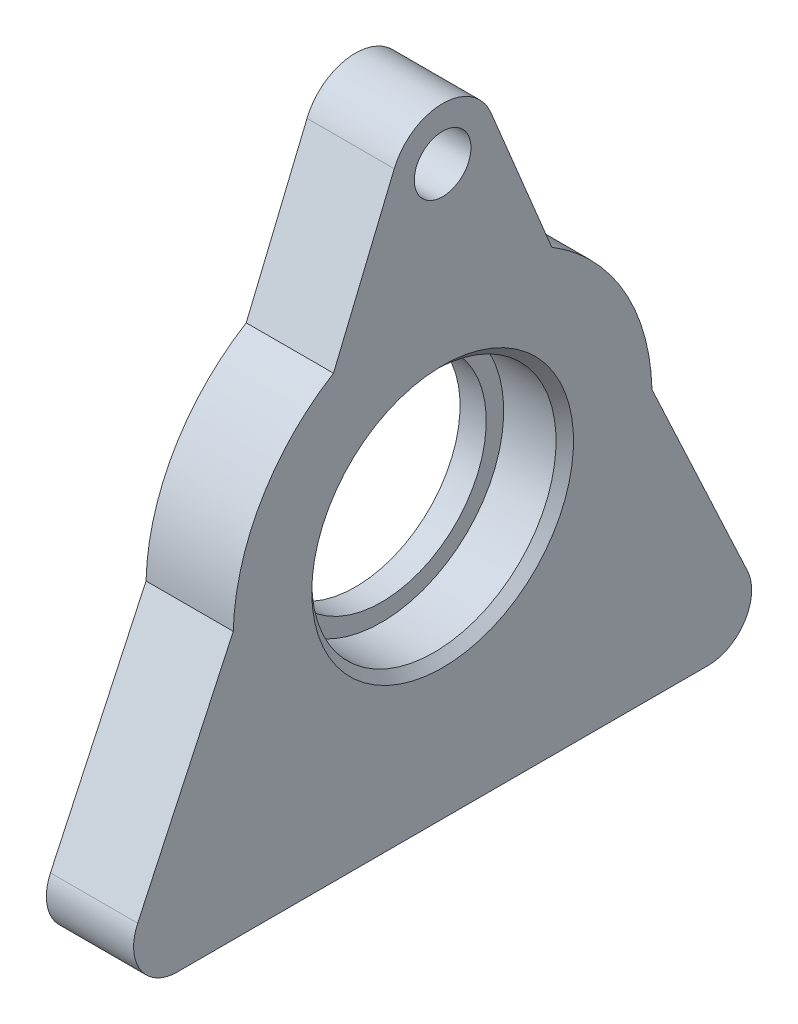
ISO-10303-21;
HEADER;
FILE_DESCRIPTION(('STEP AP214'),'2;1');
FILE_NAME('part.step','',(''),(''),'','','');
FILE_SCHEMA(('AUTOMOTIVE_DESIGN { 1 0 10303 214 1 1 1 1 }'));
ENDSEC;
DATA;
#1=APPLICATION_CONTEXT('core data for automotive mechanical design processes');
#2=APPLICATION_PROTOCOL_DEFINITION('international standard','automotive_design',2000,#1);
#3=PRODUCT_CONTEXT('',#1,'mechanical');
#4=PRODUCT('Part','Part','',(#3));
#5=PRODUCT_RELATED_PRODUCT_CATEGORY('part','',(#4));
#6=PRODUCT_DEFINITION_FORMATION('','',#4);
#7=PRODUCT_DEFINITION_CONTEXT('part definition',#1,'design');
#8=PRODUCT_DEFINITION('design','',#6,#7);
#9=PRODUCT_DEFINITION_SHAPE('','',#8);
#10=(LENGTH_UNIT() NAMED_UNIT(*) SI_UNIT(.MILLI.,.METRE.));
#11=(NAMED_UNIT(*) PLANE_ANGLE_UNIT() SI_UNIT($,.RADIAN.));
#12=(NAMED_UNIT(*) SI_UNIT($,.STERADIAN.) SOLID_ANGLE_UNIT());
#13=UNCERTAINTY_MEASURE_WITH_UNIT(LENGTH_MEASURE(1.E-05),#10,'distance_accuracy_value','');
#14=(GEOMETRIC_REPRESENTATION_CONTEXT(3) GLOBAL_UNCERTAINTY_ASSIGNED_CONTEXT((#13)) GLOBAL_UNIT_ASSIGNED_CONTEXT((#10,
#11,#12)) REPRESENTATION_CONTEXT('',''));
#15=CARTESIAN_POINT('',(0.,0.,0.));
#16=DIRECTION('',(0.,0.,1.));
#17=DIRECTION('',(1.,0.,0.));
#18=AXIS2_PLACEMENT_3D('',#15,#16,#17);
#19=CARTESIAN_POINT('',(-29.3651203100726,0.,0.));
#20=DIRECTION('',(-1.,0.,0.));
#21=DIRECTION('',(0.,0.,1.));
#22=AXIS2_PLACEMENT_3D('',#19,#20,#21);
#23=CYLINDRICAL_SURFACE('',#22,24.);
#24=CARTESIAN_POINT('',(10.,0.,0.));
#25=DIRECTION('',(-1.,0.,0.));
#26=DIRECTION('',(0.,0.,1.));
#27=AXIS2_PLACEMENT_3D('',#24,#25,#26);
#28=CIRCLE('',#27,24.);
#29=CARTESIAN_POINT('',(9.99999999999999,0.604602848507108,23.9923832787736));
#30=VERTEX_POINT('',#29);
#31=CARTESIAN_POINT('',(10.,20.4833060861503,12.5073647016899));
#32=VERTEX_POINT('',#31);
#33=EDGE_CURVE('E251',#30,#32,#28,.T.);
#34=ORIENTED_EDGE('',*,*,#33,.T.);
#35=DIRECTION('',(-1.,0.,0.));
#36=VECTOR('',#35,1.);
#37=CARTESIAN_POINT('',(10.,20.4833060861503,12.5073647016899));
#38=LINE('',#37,#36);
#39=CARTESIAN_POINT('',(0.,20.4833060861503,12.5073647016899));
#40=VERTEX_POINT('',#39);
#41=EDGE_CURVE('E77',#32,#40,#38,.T.);
#42=ORIENTED_EDGE('',*,*,#41,.T.);
#43=CARTESIAN_POINT('',(0.,0.,0.));
#44=DIRECTION('',(-1.,0.,0.));
#45=DIRECTION('',(0.,0.,1.));
#46=AXIS2_PLACEMENT_3D('',#43,#44,#45);
#47=CIRCLE('',#46,24.);
#48=CARTESIAN_POINT('',(0.,0.604602848507111,23.9923832787736));
#49=VERTEX_POINT('',#48);
#50=EDGE_CURVE('E253',#49,#40,#47,.T.);
#51=ORIENTED_EDGE('',*,*,#50,.F.);
#52=DIRECTION('',(-1.,0.,0.));
#53=VECTOR('',#52,1.);
#54=CARTESIAN_POINT('',(-29.3651203100726,0.60460284850712,23.9923832787736));
#55=LINE('',#54,#53);
#56=EDGE_CURVE('E242',#49,#30,#55,.F.);
#57=ORIENTED_EDGE('',*,*,#56,.T.);
#58=EDGE_LOOP('',(#34,#42,#51,#57));
#59=FACE_BOUND('',#58,.T.);
#60=ADVANCED_FACE('F53',(#59),#23,.T.);
#61=CARTESIAN_POINT('',(-29.3651203100726,0.,0.));
#62=DIRECTION('',(-1.,0.,0.));
#63=DIRECTION('',(0.,0.,1.));
#64=AXIS2_PLACEMENT_3D('',#61,#62,#63);
#65=CYLINDRICAL_SURFACE('',#64,14.);
#66=CARTESIAN_POINT('',(8.99999999999998,0.,0.));
#67=DIRECTION('',(-1.,0.,0.));
#68=DIRECTION('',(0.,0.,1.));
#69=AXIS2_PLACEMENT_3D('',#66,#67,#68);
#70=CIRCLE('',#69,14.);
#71=CARTESIAN_POINT('',(8.99999999999998,0.,14.));
#72=VERTEX_POINT('',#71);
#73=EDGE_CURVE('E11',#72,#72,#70,.F.);
#74=ORIENTED_EDGE('',*,*,#73,.T.);
#75=EDGE_LOOP('',(#74));
#76=FACE_BOUND('',#75,.T.);
#77=CARTESIAN_POINT('',(3.,0.,0.));
#78=DIRECTION('',(-1.,0.,0.));
#79=DIRECTION('',(0.,0.,1.));
#80=AXIS2_PLACEMENT_3D('',#77,#78,#79);
#81=CIRCLE('',#80,14.);
#82=CARTESIAN_POINT('',(3.,0.,14.));
#83=VERTEX_POINT('',#82);
#84=EDGE_CURVE('E255',#83,#83,#81,.F.);
#85=ORIENTED_EDGE('',*,*,#84,.F.);
#86=EDGE_LOOP('',(#85));
#87=FACE_BOUND('',#86,.T.);
#88=ADVANCED_FACE('F273',(#76,#87),#65,.F.);
#89=CARTESIAN_POINT('',(0.,14.,0.));
#90=DIRECTION('',(1.,0.,0.));
#91=DIRECTION('',(0.,0.,-1.));
#92=AXIS2_PLACEMENT_3D('',#89,#90,#91);
#93=PLANE('',#92);
#94=CARTESIAN_POINT('',(0.,35.,0.));
#95=DIRECTION('',(-1.,0.,0.));
#96=DIRECTION('',(0.,0.,1.));
#97=AXIS2_PLACEMENT_3D('',#94,#95,#96);
#98=CIRCLE('',#97,3.25);
#99=CARTESIAN_POINT('',(0.,35.,3.25));
#100=VERTEX_POINT('',#99);
#101=EDGE_CURVE('E297',#100,#100,#98,.T.);
#102=ORIENTED_EDGE('',*,*,#101,.F.);
#103=EDGE_LOOP('',(#102));
#104=FACE_BOUND('',#103,.T.);
#105=DIRECTION('',(0.,0.90630778703665,-0.4226182617407));
#106=VECTOR('',#105,1.);
#107=CARTESIAN_POINT('',(0.,-22.8869086912965,34.9466550114206));
#108=LINE('',#107,#106);
#109=CARTESIAN_POINT('',(0.,-22.8869086912965,34.9466550114206));
#110=VERTEX_POINT('',#109);
#111=EDGE_CURVE('E222',#110,#49,#108,.T.);
#112=ORIENTED_EDGE('',*,*,#111,.T.);
#113=ORIENTED_EDGE('',*,*,#50,.T.);
#114=DIRECTION('',(0.,0.923879532511287,-0.38268343236509));
#115=VECTOR('',#114,1.);
#116=CARTESIAN_POINT('',(0.,20.4833060861503,12.5073647016899));
#117=LINE('',#116,#115);
#118=CARTESIAN_POINT('',(0.,37.2961005941905,5.54327719506772));
#119=VERTEX_POINT('',#118);
#120=EDGE_CURVE('E165',#40,#119,#117,.T.);
#121=ORIENTED_EDGE('',*,*,#120,.T.);
#122=CARTESIAN_POINT('',(0.,35.,0.));
#123=DIRECTION('',(-1.,0.,0.));
#124=DIRECTION('',(0.,0.,1.));
#125=AXIS2_PLACEMENT_3D('',#122,#123,#124);
#126=CIRCLE('',#125,6.);
#127=CARTESIAN_POINT('',(0.,37.2961005941905,-5.54327719506772));
#128=VERTEX_POINT('',#127);
#129=EDGE_CURVE('E174',#119,#128,#126,.T.);
#130=ORIENTED_EDGE('',*,*,#129,.T.);
#131=DIRECTION('',(0.,-0.923879532511287,-0.38268343236509));
#132=VECTOR('',#131,1.);
#133=CARTESIAN_POINT('',(0.,20.4833060861503,-12.5073647016899));
#134=LINE('',#133,#132);
#135=CARTESIAN_POINT('',(0.,20.4833060861503,-12.5073647016899));
#136=VERTEX_POINT('',#135);
#137=EDGE_CURVE('E146',#128,#136,#134,.T.);
#138=ORIENTED_EDGE('',*,*,#137,.T.);
#139=CARTESIAN_POINT('',(0.,0.604602848507104,-23.9923832787736));
#140=VERTEX_POINT('',#139);
#141=EDGE_CURVE('E69',#136,#140,#47,.T.);
#142=ORIENTED_EDGE('',*,*,#141,.T.);
#143=DIRECTION('',(0.,-0.90630778703665,-0.4226182617407));
#144=VECTOR('',#143,1.);
#145=CARTESIAN_POINT('',(0.,-22.8869086912965,-34.9466550114206));
#146=LINE('',#145,#144);
#147=CARTESIAN_POINT('',(0.,-22.8869086912965,-34.9466550114206));
#148=VERTEX_POINT('',#147);
#149=EDGE_CURVE('E225',#140,#148,#146,.T.);
#150=ORIENTED_EDGE('',*,*,#149,.T.);
#151=CARTESIAN_POINT('',(0.,-25.,-30.4151160762373));
#152=DIRECTION('',(-1.,0.,0.));
#153=DIRECTION('',(0.,0.,-1.));
#154=AXIS2_PLACEMENT_3D('',#151,#152,#153);
#155=CIRCLE('',#154,5.);
#156=CARTESIAN_POINT('',(0.,-30.,-30.4151160762373));
#157=VERTEX_POINT('',#156);
#158=EDGE_CURVE('E227',#148,#157,#155,.T.);
#159=ORIENTED_EDGE('',*,*,#158,.T.);
#160=DIRECTION('',(0.,0.,1.));
#161=VECTOR('',#160,1.);
#162=CARTESIAN_POINT('',(0.,-30.,-30.4151160762373));
#163=LINE('',#162,#161);
#164=CARTESIAN_POINT('',(0.,-30.,30.4151160762374));
#165=VERTEX_POINT('',#164);
#166=EDGE_CURVE('E230',#157,#165,#163,.T.);
#167=ORIENTED_EDGE('',*,*,#166,.T.);
#168=CARTESIAN_POINT('',(0.,-25.,30.4151160762374));
#169=DIRECTION('',(-1.,0.,0.));
#170=DIRECTION('',(0.,0.,1.));
#171=AXIS2_PLACEMENT_3D('',#168,#169,#170);
#172=CIRCLE('',#171,5.);
#173=EDGE_CURVE('E207',#165,#110,#172,.T.);
#174=ORIENTED_EDGE('',*,*,#173,.T.);
#175=EDGE_LOOP('',(#112,#113,#121,#130,#138,#142,#150,#159,#167,#174));
#176=FACE_BOUND('',#175,.T.);
#177=CARTESIAN_POINT('',(0.,0.,0.));
#178=DIRECTION('',(-1.,0.,0.));
#179=DIRECTION('',(0.,0.,1.));
#180=AXIS2_PLACEMENT_3D('',#177,#178,#179);
#181=CIRCLE('',#180,12.);
#182=CARTESIAN_POINT('',(0.,0.,12.));
#183=VERTEX_POINT('',#182);
#184=EDGE_CURVE('E245',#183,#183,#181,.T.);
#185=ORIENTED_EDGE('',*,*,#184,.F.);
#186=EDGE_LOOP('',(#185));
#187=FACE_BOUND('',#186,.T.);
#188=ADVANCED_FACE('F281',(#104,#176,#187),#93,.F.);
#189=ORIENTED_EDGE('',*,*,#141,.F.);
#190=DIRECTION('',(-1.,0.,0.));
#191=VECTOR('',#190,1.);
#192=CARTESIAN_POINT('',(10.,20.4833060861503,-12.5073647016899));
#193=LINE('',#192,#191);
#194=CARTESIAN_POINT('',(10.,20.4833060861503,-12.5073647016899));
#195=VERTEX_POINT('',#194);
#196=EDGE_CURVE('E151',#195,#136,#193,.T.);
#197=ORIENTED_EDGE('',*,*,#196,.F.);
#198=CARTESIAN_POINT('',(10.,0.604602848507094,-23.9923832787737));
#199=VERTEX_POINT('',#198);
#200=EDGE_CURVE('E161',#195,#199,#28,.T.);
#201=ORIENTED_EDGE('',*,*,#200,.T.);
#202=DIRECTION('',(-1.,0.,0.));
#203=VECTOR('',#202,1.);
#204=CARTESIAN_POINT('',(-29.3651203100726,0.604602848507101,-23.9923832787736));
#205=LINE('',#204,#203);
#206=EDGE_CURVE('E210',#199,#140,#205,.T.);
#207=ORIENTED_EDGE('',*,*,#206,.T.);
#208=EDGE_LOOP('',(#189,#197,#201,#207));
#209=FACE_BOUND('',#208,.T.);
#210=ADVANCED_FACE('F275',(#209),#23,.T.);
#211=CARTESIAN_POINT('',(10.,24.,0.));
#212=DIRECTION('',(-1.,0.,0.));
#213=DIRECTION('',(0.,0.,1.));
#214=AXIS2_PLACEMENT_3D('',#211,#212,#213);
#215=PLANE('',#214);
#216=CARTESIAN_POINT('',(10.,0.,0.));
#217=DIRECTION('',(-1.,0.,0.));
#218=DIRECTION('',(0.,0.,1.));
#219=AXIS2_PLACEMENT_3D('',#216,#217,#218);
#220=CIRCLE('',#219,15.);
#221=CARTESIAN_POINT('',(10.,0.,15.));
#222=VERTEX_POINT('',#221);
#223=EDGE_CURVE('E62',#222,#222,#220,.T.);
#224=ORIENTED_EDGE('',*,*,#223,.T.);
#225=EDGE_LOOP('',(#224));
#226=FACE_BOUND('',#225,.T.);
#227=CARTESIAN_POINT('',(10.,35.,0.));
#228=DIRECTION('',(-1.,0.,0.));
#229=DIRECTION('',(0.,0.,1.));
#230=AXIS2_PLACEMENT_3D('',#227,#228,#229);
#231=CIRCLE('',#230,3.25);
#232=CARTESIAN_POINT('',(10.,35.,3.25));
#233=VERTEX_POINT('',#232);
#234=EDGE_CURVE('E170',#233,#233,#231,.T.);
#235=ORIENTED_EDGE('',*,*,#234,.T.);
#236=EDGE_LOOP('',(#235));
#237=FACE_BOUND('',#236,.T.);
#238=ORIENTED_EDGE('',*,*,#33,.F.);
#239=DIRECTION('',(0.,-0.90630778703665,0.4226182617407));
#240=VECTOR('',#239,1.);
#241=CARTESIAN_POINT('',(9.99999999999999,-22.8869086912965,34.9466550114206));
#242=LINE('',#241,#240);
#243=CARTESIAN_POINT('',(9.99999999999999,-22.8869086912965,34.9466550114206));
#244=VERTEX_POINT('',#243);
#245=EDGE_CURVE('E208',#30,#244,#242,.T.);
#246=ORIENTED_EDGE('',*,*,#245,.T.);
#247=CARTESIAN_POINT('',(9.99999999999999,-25.,30.4151160762374));
#248=DIRECTION('',(-1.,0.,0.));
#249=DIRECTION('',(0.,0.,1.));
#250=AXIS2_PLACEMENT_3D('',#247,#248,#249);
#251=CIRCLE('',#250,5.);
#252=CARTESIAN_POINT('',(9.99999999999999,-30.,30.4151160762374));
#253=VERTEX_POINT('',#252);
#254=EDGE_CURVE('E211',#244,#253,#251,.F.);
#255=ORIENTED_EDGE('',*,*,#254,.T.);
#256=DIRECTION('',(0.,0.,-1.));
#257=VECTOR('',#256,1.);
#258=CARTESIAN_POINT('',(9.99999999999999,-30.,-30.4151160762373));
#259=LINE('',#258,#257);
#260=CARTESIAN_POINT('',(9.99999999999999,-30.,-30.4151160762373));
#261=VERTEX_POINT('',#260);
#262=EDGE_CURVE('E217',#253,#261,#259,.T.);
#263=ORIENTED_EDGE('',*,*,#262,.T.);
#264=CARTESIAN_POINT('',(9.99999999999999,-25.,-30.4151160762373));
#265=DIRECTION('',(-1.,0.,0.));
#266=DIRECTION('',(0.,0.,1.));
#267=AXIS2_PLACEMENT_3D('',#264,#265,#266);
#268=CIRCLE('',#267,5.);
#269=CARTESIAN_POINT('',(9.99999999999999,-22.8869086912965,-34.9466550114206));
#270=VERTEX_POINT('',#269);
#271=EDGE_CURVE('E214',#261,#270,#268,.F.);
#272=ORIENTED_EDGE('',*,*,#271,.T.);
#273=DIRECTION('',(0.,0.90630778703665,0.4226182617407));
#274=VECTOR('',#273,1.);
#275=CARTESIAN_POINT('',(9.99999999999999,-22.8869086912965,-34.9466550114206));
#276=LINE('',#275,#274);
#277=EDGE_CURVE('E212',#270,#199,#276,.T.);
#278=ORIENTED_EDGE('',*,*,#277,.T.);
#279=ORIENTED_EDGE('',*,*,#200,.F.);
#280=DIRECTION('',(0.,-0.923879532511287,-0.38268343236509));
#281=VECTOR('',#280,1.);
#282=CARTESIAN_POINT('',(10.,20.4833060861503,-12.5073647016899));
#283=LINE('',#282,#281);
#284=CARTESIAN_POINT('',(10.,37.2961005941905,-5.54327719506772));
#285=VERTEX_POINT('',#284);
#286=EDGE_CURVE('E144',#285,#195,#283,.T.);
#287=ORIENTED_EDGE('',*,*,#286,.F.);
#288=CARTESIAN_POINT('',(10.,35.,0.));
#289=DIRECTION('',(-1.,0.,0.));
#290=DIRECTION('',(0.,0.,1.));
#291=AXIS2_PLACEMENT_3D('',#288,#289,#290);
#292=CIRCLE('',#291,6.);
#293=CARTESIAN_POINT('',(10.,37.2961005941905,5.54327719506772));
#294=VERTEX_POINT('',#293);
#295=EDGE_CURVE('E158',#294,#285,#292,.T.);
#296=ORIENTED_EDGE('',*,*,#295,.F.);
#297=DIRECTION('',(0.,0.923879532511287,-0.38268343236509));
#298=VECTOR('',#297,1.);
#299=CARTESIAN_POINT('',(10.,20.4833060861503,12.5073647016899));
#300=LINE('',#299,#298);
#301=EDGE_CURVE('E152',#32,#294,#300,.T.);
#302=ORIENTED_EDGE('',*,*,#301,.F.);
#303=EDGE_LOOP('',(#238,#246,#255,#263,#272,#278,#279,#287,#296,#302));
#304=FACE_BOUND('',#303,.T.);
#305=ADVANCED_FACE('F156',(#226,#237,#304),#215,.F.);
#306=CARTESIAN_POINT('',(3.,0.,0.));
#307=DIRECTION('',(-1.,0.,0.));
#308=DIRECTION('',(0.,0.,1.));
#309=AXIS2_PLACEMENT_3D('',#306,#307,#308);
#310=PLANE('',#309);
#311=CARTESIAN_POINT('',(3.,0.,0.));
#312=DIRECTION('',(-1.,0.,0.));
#313=DIRECTION('',(0.,0.,1.));
#314=AXIS2_PLACEMENT_3D('',#311,#312,#313);
#315=CIRCLE('',#314,12.);
#316=CARTESIAN_POINT('',(3.,0.,12.));
#317=VERTEX_POINT('',#316);
#318=EDGE_CURVE('E246',#317,#317,#315,.T.);
#319=ORIENTED_EDGE('',*,*,#318,.T.);
#320=EDGE_LOOP('',(#319));
#321=FACE_BOUND('',#320,.T.);
#322=ORIENTED_EDGE('',*,*,#84,.T.);
#323=EDGE_LOOP('',(#322));
#324=FACE_BOUND('',#323,.T.);
#325=ADVANCED_FACE('F288',(#321,#324),#310,.F.);
#326=CARTESIAN_POINT('',(3.,0.,0.));
#327=DIRECTION('',(-1.,0.,0.));
#328=DIRECTION('',(0.,0.,1.));
#329=AXIS2_PLACEMENT_3D('',#326,#327,#328);
#330=CYLINDRICAL_SURFACE('',#329,12.);
#331=ORIENTED_EDGE('',*,*,#318,.F.);
#332=EDGE_LOOP('',(#331));
#333=FACE_BOUND('',#332,.T.);
#334=ORIENTED_EDGE('',*,*,#184,.T.);
#335=EDGE_LOOP('',(#334));
#336=FACE_BOUND('',#335,.T.);
#337=ADVANCED_FACE('F302',(#333,#336),#330,.F.);
#338=CARTESIAN_POINT('',(97.868775948988,-22.8869086912965,34.9466550114206));
#339=DIRECTION('',(0.,0.4226182617407,0.90630778703665));
#340=DIRECTION('',(0.,-0.90630778703665,0.4226182617407));
#341=AXIS2_PLACEMENT_3D('',#338,#339,#340);
#342=PLANE('',#341);
#343=ORIENTED_EDGE('',*,*,#56,.F.);
#344=ORIENTED_EDGE('',*,*,#111,.F.);
#345=DIRECTION('',(-1.,0.,0.));
#346=VECTOR('',#345,1.);
#347=CARTESIAN_POINT('',(97.868775948988,-22.8869086912965,34.9466550114206));
#348=LINE('',#347,#346);
#349=EDGE_CURVE('E233',#244,#110,#348,.T.);
#350=ORIENTED_EDGE('',*,*,#349,.F.);
#351=ORIENTED_EDGE('',*,*,#245,.F.);
#352=EDGE_LOOP('',(#343,#344,#350,#351));
#353=FACE_BOUND('',#352,.T.);
#354=ADVANCED_FACE('F304',(#353),#342,.T.);
#355=CARTESIAN_POINT('',(97.868775948988,-22.8869086912965,-34.9466550114206));
#356=DIRECTION('',(0.,0.4226182617407,-0.90630778703665));
#357=DIRECTION('',(0.,0.90630778703665,0.4226182617407));
#358=AXIS2_PLACEMENT_3D('',#355,#356,#357);
#359=PLANE('',#358);
#360=ORIENTED_EDGE('',*,*,#206,.F.);
#361=ORIENTED_EDGE('',*,*,#277,.F.);
#362=DIRECTION('',(-1.,0.,0.));
#363=VECTOR('',#362,1.);
#364=CARTESIAN_POINT('',(97.868775948988,-22.8869086912965,-34.9466550114206));
#365=LINE('',#364,#363);
#366=EDGE_CURVE('E237',#270,#148,#365,.T.);
#367=ORIENTED_EDGE('',*,*,#366,.T.);
#368=ORIENTED_EDGE('',*,*,#149,.F.);
#369=EDGE_LOOP('',(#360,#361,#367,#368));
#370=FACE_BOUND('',#369,.T.);
#371=ADVANCED_FACE('F311',(#370),#359,.T.);
#372=CARTESIAN_POINT('',(97.868775948988,-25.,-30.4151160762373));
#373=DIRECTION('',(-1.,0.,0.));
#374=DIRECTION('',(0.,0.,1.));
#375=AXIS2_PLACEMENT_3D('',#372,#373,#374);
#376=CYLINDRICAL_SURFACE('',#375,5.);
#377=ORIENTED_EDGE('',*,*,#271,.F.);
#378=DIRECTION('',(-1.,0.,0.));
#379=VECTOR('',#378,1.);
#380=CARTESIAN_POINT('',(97.868775948988,-30.,-30.4151160762373));
#381=LINE('',#380,#379);
#382=EDGE_CURVE('E235',#261,#157,#381,.T.);
#383=ORIENTED_EDGE('',*,*,#382,.T.);
#384=ORIENTED_EDGE('',*,*,#158,.F.);
#385=ORIENTED_EDGE('',*,*,#366,.F.);
#386=EDGE_LOOP('',(#377,#383,#384,#385));
#387=FACE_BOUND('',#386,.T.);
#388=ADVANCED_FACE('F326',(#387),#376,.T.);
#389=CARTESIAN_POINT('',(97.868775948988,-30.,-30.4151160762373));
#390=DIRECTION('',(0.,-1.,0.));
#391=DIRECTION('',(0.,0.,-1.));
#392=AXIS2_PLACEMENT_3D('',#389,#390,#391);
#393=PLANE('',#392);
#394=CARTESIAN_POINT('',(5.,-30.,-25.));
#395=DIRECTION('',(0.,-1.,0.));
#396=DIRECTION('',(0.,0.,-1.));
#397=AXIS2_PLACEMENT_3D('',#394,#395,#396);
#398=CIRCLE('',#397,2.5);
#399=CARTESIAN_POINT('',(5.,-30.,-27.5));
#400=VERTEX_POINT('',#399);
#401=EDGE_CURVE('E178',#400,#400,#398,.T.);
#402=ORIENTED_EDGE('',*,*,#401,.F.);
#403=EDGE_LOOP('',(#402));
#404=FACE_BOUND('',#403,.T.);
#405=CARTESIAN_POINT('',(5.,-30.,25.));
#406=DIRECTION('',(0.,-1.,0.));
#407=DIRECTION('',(0.,0.,-1.));
#408=AXIS2_PLACEMENT_3D('',#405,#406,#407);
#409=CIRCLE('',#408,2.5);
#410=CARTESIAN_POINT('',(5.,-30.,22.5));
#411=VERTEX_POINT('',#410);
#412=EDGE_CURVE('E189',#411,#411,#409,.T.);
#413=ORIENTED_EDGE('',*,*,#412,.F.);
#414=EDGE_LOOP('',(#413));
#415=FACE_BOUND('',#414,.T.);
#416=CARTESIAN_POINT('',(5.,-30.,0.));
#417=DIRECTION('',(0.,-1.,0.));
#418=DIRECTION('',(0.,0.,-1.));
#419=AXIS2_PLACEMENT_3D('',#416,#417,#418);
#420=CIRCLE('',#419,2.5);
#421=CARTESIAN_POINT('',(5.,-30.,-2.5));
#422=VERTEX_POINT('',#421);
#423=EDGE_CURVE('E198',#422,#422,#420,.T.);
#424=ORIENTED_EDGE('',*,*,#423,.F.);
#425=EDGE_LOOP('',(#424));
#426=FACE_BOUND('',#425,.T.);
#427=ORIENTED_EDGE('',*,*,#262,.F.);
#428=DIRECTION('',(-1.,0.,0.));
#429=VECTOR('',#428,1.);
#430=CARTESIAN_POINT('',(97.868775948988,-30.,30.4151160762374));
#431=LINE('',#430,#429);
#432=EDGE_CURVE('E215',#253,#165,#431,.T.);
#433=ORIENTED_EDGE('',*,*,#432,.T.);
#434=ORIENTED_EDGE('',*,*,#166,.F.);
#435=ORIENTED_EDGE('',*,*,#382,.F.);
#436=EDGE_LOOP('',(#427,#433,#434,#435));
#437=FACE_BOUND('',#436,.T.);
#438=ADVANCED_FACE('F321',(#404,#415,#426,#437),#393,.T.);
#439=CARTESIAN_POINT('',(97.868775948988,-25.,30.4151160762374));
#440=DIRECTION('',(-1.,0.,0.));
#441=DIRECTION('',(0.,0.,1.));
#442=AXIS2_PLACEMENT_3D('',#439,#440,#441);
#443=CYLINDRICAL_SURFACE('',#442,5.);
#444=ORIENTED_EDGE('',*,*,#254,.F.);
#445=ORIENTED_EDGE('',*,*,#349,.T.);
#446=ORIENTED_EDGE('',*,*,#173,.F.);
#447=ORIENTED_EDGE('',*,*,#432,.F.);
#448=EDGE_LOOP('',(#444,#445,#446,#447));
#449=FACE_BOUND('',#448,.T.);
#450=ADVANCED_FACE('F318',(#449),#443,.T.);
#451=CARTESIAN_POINT('',(5.,-18.,0.));
#452=DIRECTION('',(0.,-1.,0.));
#453=DIRECTION('',(0.,0.,-1.));
#454=AXIS2_PLACEMENT_3D('',#451,#452,#453);
#455=CONICAL_SURFACE('',#454,1.65,1.02974425867665);
#456=CARTESIAN_POINT('',(5.,-17.0085799786045,0.));
#457=VERTEX_POINT('',#456);
#458=VERTEX_LOOP('',#457);
#459=FACE_BOUND('',#458,.T.);
#460=CARTESIAN_POINT('',(5.,-18.,0.));
#461=DIRECTION('',(0.,-1.,0.));
#462=DIRECTION('',(0.,0.,-1.));
#463=AXIS2_PLACEMENT_3D('',#460,#461,#462);
#464=CIRCLE('',#463,1.65);
#465=CARTESIAN_POINT('',(5.,-18.,-1.64999999999999));
#466=VERTEX_POINT('',#465);
#467=EDGE_CURVE('E204',#466,#466,#464,.T.);
#468=ORIENTED_EDGE('',*,*,#467,.T.);
#469=EDGE_LOOP('',(#468));
#470=FACE_BOUND('',#469,.T.);
#471=ADVANCED_FACE('F320',(#459,#470),#455,.F.);
#472=CARTESIAN_POINT('',(5.,-30.,0.));
#473=DIRECTION('',(0.,-1.,0.));
#474=DIRECTION('',(0.,0.,-1.));
#475=AXIS2_PLACEMENT_3D('',#472,#473,#474);
#476=CYLINDRICAL_SURFACE('',#475,1.65);
#477=ORIENTED_EDGE('',*,*,#467,.F.);
#478=EDGE_LOOP('',(#477));
#479=FACE_BOUND('',#478,.T.);
#480=CARTESIAN_POINT('',(5.,-29.15,0.));
#481=DIRECTION('',(0.,-1.,0.));
#482=DIRECTION('',(0.,0.,-1.));
#483=AXIS2_PLACEMENT_3D('',#480,#481,#482);
#484=CIRCLE('',#483,1.65);
#485=CARTESIAN_POINT('',(5.,-29.15,-1.65));
#486=VERTEX_POINT('',#485);
#487=EDGE_CURVE('E201',#486,#486,#484,.T.);
#488=ORIENTED_EDGE('',*,*,#487,.T.);
#489=EDGE_LOOP('',(#488));
#490=FACE_BOUND('',#489,.T.);
#491=ADVANCED_FACE('F336',(#479,#490),#476,.F.);
#492=CARTESIAN_POINT('',(5.,-30.,0.));
#493=DIRECTION('',(0.,-1.,0.));
#494=DIRECTION('',(0.,0.,-1.));
#495=AXIS2_PLACEMENT_3D('',#492,#493,#494);
#496=CONICAL_SURFACE('',#495,2.5,0.785398163397449);
#497=ORIENTED_EDGE('',*,*,#487,.F.);
#498=EDGE_LOOP('',(#497));
#499=FACE_BOUND('',#498,.T.);
#500=ORIENTED_EDGE('',*,*,#423,.T.);
#501=EDGE_LOOP('',(#500));
#502=FACE_BOUND('',#501,.T.);
#503=ADVANCED_FACE('F340',(#499,#502),#496,.F.);
#504=CARTESIAN_POINT('',(5.,-18.,25.));
#505=DIRECTION('',(0.,-1.,0.));
#506=DIRECTION('',(0.,0.,-1.));
#507=AXIS2_PLACEMENT_3D('',#504,#505,#506);
#508=CONICAL_SURFACE('',#507,1.65,1.02974425867665);
#509=CARTESIAN_POINT('',(5.,-17.0085799786045,25.));
#510=VERTEX_POINT('',#509);
#511=VERTEX_LOOP('',#510);
#512=FACE_BOUND('',#511,.T.);
#513=CARTESIAN_POINT('',(5.,-18.,25.));
#514=DIRECTION('',(0.,-1.,0.));
#515=DIRECTION('',(0.,0.,-1.));
#516=AXIS2_PLACEMENT_3D('',#513,#514,#515);
#517=CIRCLE('',#516,1.65);
#518=CARTESIAN_POINT('',(5.,-18.,23.35));
#519=VERTEX_POINT('',#518);
#520=EDGE_CURVE('E195',#519,#519,#517,.T.);
#521=ORIENTED_EDGE('',*,*,#520,.T.);
#522=EDGE_LOOP('',(#521));
#523=FACE_BOUND('',#522,.T.);
#524=ADVANCED_FACE('F344',(#512,#523),#508,.F.);
#525=CARTESIAN_POINT('',(5.,-30.,25.));
#526=DIRECTION('',(0.,-1.,0.));
#527=DIRECTION('',(0.,0.,-1.));
#528=AXIS2_PLACEMENT_3D('',#525,#526,#527);
#529=CYLINDRICAL_SURFACE('',#528,1.65);
#530=ORIENTED_EDGE('',*,*,#520,.F.);
#531=EDGE_LOOP('',(#530));
#532=FACE_BOUND('',#531,.T.);
#533=CARTESIAN_POINT('',(5.,-29.15,25.));
#534=DIRECTION('',(0.,-1.,0.));
#535=DIRECTION('',(0.,0.,-1.));
#536=AXIS2_PLACEMENT_3D('',#533,#534,#535);
#537=CIRCLE('',#536,1.65);
#538=CARTESIAN_POINT('',(5.,-29.15,23.35));
#539=VERTEX_POINT('',#538);
#540=EDGE_CURVE('E192',#539,#539,#537,.T.);
#541=ORIENTED_EDGE('',*,*,#540,.T.);
#542=EDGE_LOOP('',(#541));
#543=FACE_BOUND('',#542,.T.);
#544=ADVANCED_FACE('F348',(#532,#543),#529,.F.);
#545=CARTESIAN_POINT('',(5.,-30.,25.));
#546=DIRECTION('',(0.,-1.,0.));
#547=DIRECTION('',(0.,0.,-1.));
#548=AXIS2_PLACEMENT_3D('',#545,#546,#547);
#549=CONICAL_SURFACE('',#548,2.5,0.785398163397449);
#550=ORIENTED_EDGE('',*,*,#540,.F.);
#551=EDGE_LOOP('',(#550));
#552=FACE_BOUND('',#551,.T.);
#553=ORIENTED_EDGE('',*,*,#412,.T.);
#554=EDGE_LOOP('',(#553));
#555=FACE_BOUND('',#554,.T.);
#556=ADVANCED_FACE('F352',(#552,#555),#549,.F.);
#557=CARTESIAN_POINT('',(5.,-18.,-25.));
#558=DIRECTION('',(0.,-1.,0.));
#559=DIRECTION('',(0.,0.,-1.));
#560=AXIS2_PLACEMENT_3D('',#557,#558,#559);
#561=CONICAL_SURFACE('',#560,1.65,1.02974425867665);
#562=CARTESIAN_POINT('',(5.,-17.0085799786045,-25.));
#563=VERTEX_POINT('',#562);
#564=VERTEX_LOOP('',#563);
#565=FACE_BOUND('',#564,.T.);
#566=CARTESIAN_POINT('',(5.,-18.,-25.));
#567=DIRECTION('',(0.,-1.,0.));
#568=DIRECTION('',(0.,0.,-1.));
#569=AXIS2_PLACEMENT_3D('',#566,#567,#568);
#570=CIRCLE('',#569,1.65);
#571=CARTESIAN_POINT('',(5.,-18.,-26.65));
#572=VERTEX_POINT('',#571);
#573=EDGE_CURVE('E186',#572,#572,#570,.T.);
#574=ORIENTED_EDGE('',*,*,#573,.T.);
#575=EDGE_LOOP('',(#574));
#576=FACE_BOUND('',#575,.T.);
#577=ADVANCED_FACE('F356',(#565,#576),#561,.F.);
#578=CARTESIAN_POINT('',(5.,-30.,-25.));
#579=DIRECTION('',(0.,-1.,0.));
#580=DIRECTION('',(0.,0.,-1.));
#581=AXIS2_PLACEMENT_3D('',#578,#579,#580);
#582=CYLINDRICAL_SURFACE('',#581,1.65);
#583=ORIENTED_EDGE('',*,*,#573,.F.);
#584=EDGE_LOOP('',(#583));
#585=FACE_BOUND('',#584,.T.);
#586=CARTESIAN_POINT('',(5.,-29.15,-25.));
#587=DIRECTION('',(0.,-1.,0.));
#588=DIRECTION('',(0.,0.,-1.));
#589=AXIS2_PLACEMENT_3D('',#586,#587,#588);
#590=CIRCLE('',#589,1.65);
#591=CARTESIAN_POINT('',(5.,-29.15,-26.65));
#592=VERTEX_POINT('',#591);
#593=EDGE_CURVE('E183',#592,#592,#590,.T.);
#594=ORIENTED_EDGE('',*,*,#593,.T.);
#595=EDGE_LOOP('',(#594));
#596=FACE_BOUND('',#595,.T.);
#597=ADVANCED_FACE('F360',(#585,#596),#582,.F.);
#598=CARTESIAN_POINT('',(5.,-30.,-25.));
#599=DIRECTION('',(0.,-1.,0.));
#600=DIRECTION('',(0.,0.,-1.));
#601=AXIS2_PLACEMENT_3D('',#598,#599,#600);
#602=CONICAL_SURFACE('',#601,2.5,0.785398163397449);
#603=ORIENTED_EDGE('',*,*,#593,.F.);
#604=EDGE_LOOP('',(#603));
#605=FACE_BOUND('',#604,.T.);
#606=ORIENTED_EDGE('',*,*,#401,.T.);
#607=EDGE_LOOP('',(#606));
#608=FACE_BOUND('',#607,.T.);
#609=ADVANCED_FACE('F364',(#605,#608),#602,.F.);
#610=CARTESIAN_POINT('',(10.,35.,0.));
#611=DIRECTION('',(-1.,0.,0.));
#612=DIRECTION('',(0.,0.,1.));
#613=AXIS2_PLACEMENT_3D('',#610,#611,#612);
#614=CYLINDRICAL_SURFACE('',#613,6.);
#615=ORIENTED_EDGE('',*,*,#129,.F.);
#616=DIRECTION('',(-1.,0.,0.));
#617=VECTOR('',#616,1.);
#618=CARTESIAN_POINT('',(10.,37.2961005941905,5.54327719506772));
#619=LINE('',#618,#617);
#620=EDGE_CURVE('E164',#294,#119,#619,.T.);
#621=ORIENTED_EDGE('',*,*,#620,.F.);
#622=ORIENTED_EDGE('',*,*,#295,.T.);
#623=DIRECTION('',(-1.,0.,0.));
#624=VECTOR('',#623,1.);
#625=CARTESIAN_POINT('',(10.,37.2961005941905,-5.54327719506772));
#626=LINE('',#625,#624);
#627=EDGE_CURVE('E141',#285,#128,#626,.T.);
#628=ORIENTED_EDGE('',*,*,#627,.T.);
#629=EDGE_LOOP('',(#615,#621,#622,#628));
#630=FACE_BOUND('',#629,.T.);
#631=ADVANCED_FACE('F163',(#630),#614,.T.);
#632=CARTESIAN_POINT('',(10.,20.4833060861503,12.5073647016899));
#633=DIRECTION('',(0.,0.38268343236509,0.923879532511287));
#634=DIRECTION('',(0.,-0.923879532511287,0.38268343236509));
#635=AXIS2_PLACEMENT_3D('',#632,#633,#634);
#636=PLANE('',#635);
#637=ORIENTED_EDGE('',*,*,#120,.F.);
#638=ORIENTED_EDGE('',*,*,#41,.F.);
#639=ORIENTED_EDGE('',*,*,#301,.T.);
#640=ORIENTED_EDGE('',*,*,#620,.T.);
#641=EDGE_LOOP('',(#637,#638,#639,#640));
#642=FACE_BOUND('',#641,.T.);
#643=ADVANCED_FACE('F370',(#642),#636,.T.);
#644=CARTESIAN_POINT('',(10.,20.4833060861503,-12.5073647016899));
#645=DIRECTION('',(0.,0.38268343236509,-0.923879532511287));
#646=DIRECTION('',(0.,0.923879532511287,0.38268343236509));
#647=AXIS2_PLACEMENT_3D('',#644,#645,#646);
#648=PLANE('',#647);
#649=ORIENTED_EDGE('',*,*,#137,.F.);
#650=ORIENTED_EDGE('',*,*,#627,.F.);
#651=ORIENTED_EDGE('',*,*,#286,.T.);
#652=ORIENTED_EDGE('',*,*,#196,.T.);
#653=EDGE_LOOP('',(#649,#650,#651,#652));
#654=FACE_BOUND('',#653,.T.);
#655=ADVANCED_FACE('F143',(#654),#648,.T.);
#656=CARTESIAN_POINT('',(0.,35.,0.));
#657=DIRECTION('',(-1.,0.,0.));
#658=DIRECTION('',(0.,0.,1.));
#659=AXIS2_PLACEMENT_3D('',#656,#657,#658);
#660=CYLINDRICAL_SURFACE('',#659,3.25);
#661=ORIENTED_EDGE('',*,*,#234,.F.);
#662=EDGE_LOOP('',(#661));
#663=FACE_BOUND('',#662,.T.);
#664=ORIENTED_EDGE('',*,*,#101,.T.);
#665=EDGE_LOOP('',(#664));
#666=FACE_BOUND('',#665,.T.);
#667=ADVANCED_FACE('F263',(#663,#666),#660,.F.);
#668=CARTESIAN_POINT('',(10.,0.,0.));
#669=DIRECTION('',(1.,0.,0.));
#670=DIRECTION('',(0.,0.,-1.));
#671=AXIS2_PLACEMENT_3D('',#668,#669,#670);
#672=CONICAL_SURFACE('',#671,15.,0.785398163397445);
#673=ORIENTED_EDGE('',*,*,#73,.F.);
#674=EDGE_LOOP('',(#673));
#675=FACE_BOUND('',#674,.T.);
#676=ORIENTED_EDGE('',*,*,#223,.F.);
#677=EDGE_LOOP('',(#676));
#678=FACE_BOUND('',#677,.T.);
#679=ADVANCED_FACE('F56',(#675,#678),#672,.F.);
#680=CLOSED_SHELL('',(#60,#88,#188,#210,#305,#325,#337,#354,#371,#388,#438,#450,#471,#491,#503,
#524,#544,#556,#577,#597,#609,#631,#643,#655,#667,#679));
#681=MANIFOLD_SOLID_BREP('B2',#680);
#682=ADVANCED_BREP_SHAPE_REPRESENTATION('',(#18,#681),#14);
#683=SHAPE_DEFINITION_REPRESENTATION(#9,#682);
ENDSEC;
END-ISO-10303-21;
